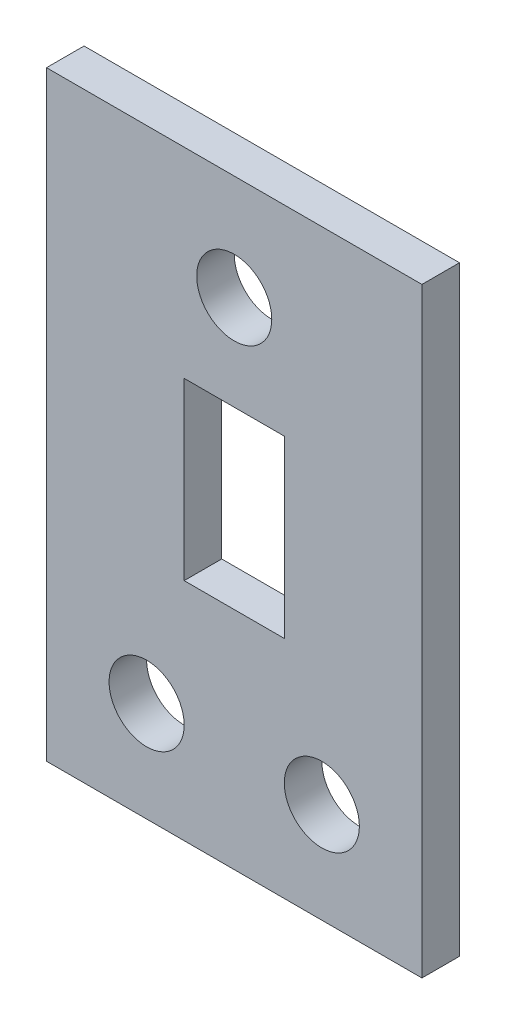
ISO-10303-21;
HEADER;
FILE_DESCRIPTION(('STEP AP214'),'2;1');
FILE_NAME('part.step','',(''),(''),'','','');
FILE_SCHEMA(('AUTOMOTIVE_DESIGN { 1 0 10303 214 1 1 1 1 }'));
ENDSEC;
DATA;
#1=APPLICATION_CONTEXT('core data for automotive mechanical design processes');
#2=APPLICATION_PROTOCOL_DEFINITION('international standard','automotive_design',2000,#1);
#3=PRODUCT_CONTEXT('',#1,'mechanical');
#4=PRODUCT('Part','Part','',(#3));
#5=PRODUCT_RELATED_PRODUCT_CATEGORY('part','',(#4));
#6=PRODUCT_DEFINITION_FORMATION('','',#4);
#7=PRODUCT_DEFINITION_CONTEXT('part definition',#1,'design');
#8=PRODUCT_DEFINITION('design','',#6,#7);
#9=PRODUCT_DEFINITION_SHAPE('','',#8);
#10=(LENGTH_UNIT() NAMED_UNIT(*) SI_UNIT(.MILLI.,.METRE.));
#11=(NAMED_UNIT(*) PLANE_ANGLE_UNIT() SI_UNIT($,.RADIAN.));
#12=(NAMED_UNIT(*) SI_UNIT($,.STERADIAN.) SOLID_ANGLE_UNIT());
#13=UNCERTAINTY_MEASURE_WITH_UNIT(LENGTH_MEASURE(1.E-05),#10,'distance_accuracy_value','');
#14=(GEOMETRIC_REPRESENTATION_CONTEXT(3) GLOBAL_UNCERTAINTY_ASSIGNED_CONTEXT((#13)) GLOBAL_UNIT_ASSIGNED_CONTEXT((#10,
#11,#12)) REPRESENTATION_CONTEXT('',''));
#15=CARTESIAN_POINT('',(0.,0.,0.));
#16=DIRECTION('',(0.,0.,1.));
#17=DIRECTION('',(1.,0.,0.));
#18=AXIS2_PLACEMENT_3D('',#15,#16,#17);
#19=CARTESIAN_POINT('',(-12.5455284850989,32.9531578947368,1.5));
#20=DIRECTION('',(1.,0.,0.));
#21=DIRECTION('',(0.,1.,0.));
#22=AXIS2_PLACEMENT_3D('',#19,#20,#21);
#23=PLANE('',#22);
#24=DIRECTION('',(0.,-1.,0.));
#25=VECTOR('',#24,1.);
#26=CARTESIAN_POINT('',(-12.5455284850989,32.9531578947368,0.));
#27=LINE('',#26,#25);
#28=CARTESIAN_POINT('',(-12.5455284850989,32.9531578947368,0.));
#29=VERTEX_POINT('',#28);
#30=CARTESIAN_POINT('',(-12.5455284850989,8.95315789473685,0.));
#31=VERTEX_POINT('',#30);
#32=EDGE_CURVE('E145',#29,#31,#27,.T.);
#33=ORIENTED_EDGE('',*,*,#32,.T.);
#34=DIRECTION('',(0.,0.,-1.));
#35=VECTOR('',#34,1.);
#36=CARTESIAN_POINT('',(-12.5455284850989,8.95315789473685,1.5));
#37=LINE('',#36,#35);
#38=CARTESIAN_POINT('',(-12.5455284850989,8.95315789473685,1.5));
#39=VERTEX_POINT('',#38);
#40=EDGE_CURVE('E161',#39,#31,#37,.T.);
#41=ORIENTED_EDGE('',*,*,#40,.F.);
#42=DIRECTION('',(0.,-1.,0.));
#43=VECTOR('',#42,1.);
#44=CARTESIAN_POINT('',(-12.5455284850989,32.9531578947368,1.5));
#45=LINE('',#44,#43);
#46=CARTESIAN_POINT('',(-12.5455284850989,32.9531578947368,1.5));
#47=VERTEX_POINT('',#46);
#48=EDGE_CURVE('E134',#47,#39,#45,.T.);
#49=ORIENTED_EDGE('',*,*,#48,.F.);
#50=DIRECTION('',(0.,0.,-1.));
#51=VECTOR('',#50,1.);
#52=CARTESIAN_POINT('',(-12.5455284850989,32.9531578947368,1.5));
#53=LINE('',#52,#51);
#54=EDGE_CURVE('E144',#47,#29,#53,.T.);
#55=ORIENTED_EDGE('',*,*,#54,.T.);
#56=EDGE_LOOP('',(#33,#41,#49,#55));
#57=FACE_BOUND('',#56,.T.);
#58=ADVANCED_FACE('F30',(#57),#23,.F.);
#59=CARTESIAN_POINT('',(-12.5455284850989,8.95315789473685,1.5));
#60=DIRECTION('',(0.,1.,0.));
#61=DIRECTION('',(0.,0.,1.));
#62=AXIS2_PLACEMENT_3D('',#59,#60,#61);
#63=PLANE('',#62);
#64=DIRECTION('',(1.,0.,0.));
#65=VECTOR('',#64,1.);
#66=CARTESIAN_POINT('',(-12.5455284850989,8.95315789473685,0.));
#67=LINE('',#66,#65);
#68=CARTESIAN_POINT('',(2.4544715149011,8.95315789473685,0.));
#69=VERTEX_POINT('',#68);
#70=EDGE_CURVE('E148',#31,#69,#67,.T.);
#71=ORIENTED_EDGE('',*,*,#70,.T.);
#72=DIRECTION('',(0.,0.,-1.));
#73=VECTOR('',#72,1.);
#74=CARTESIAN_POINT('',(2.4544715149011,8.95315789473685,1.5));
#75=LINE('',#74,#73);
#76=CARTESIAN_POINT('',(2.4544715149011,8.95315789473685,1.5));
#77=VERTEX_POINT('',#76);
#78=EDGE_CURVE('E158',#77,#69,#75,.T.);
#79=ORIENTED_EDGE('',*,*,#78,.F.);
#80=DIRECTION('',(1.,0.,0.));
#81=VECTOR('',#80,1.);
#82=CARTESIAN_POINT('',(-12.5455284850989,8.95315789473685,1.5));
#83=LINE('',#82,#81);
#84=EDGE_CURVE('E137',#39,#77,#83,.T.);
#85=ORIENTED_EDGE('',*,*,#84,.F.);
#86=ORIENTED_EDGE('',*,*,#40,.T.);
#87=EDGE_LOOP('',(#71,#79,#85,#86));
#88=FACE_BOUND('',#87,.T.);
#89=ADVANCED_FACE('F193',(#88),#63,.F.);
#90=CARTESIAN_POINT('',(2.45447151490109,32.9531578947368,1.5));
#91=DIRECTION('',(-1.,0.,0.));
#92=DIRECTION('',(0.,-1.,0.));
#93=AXIS2_PLACEMENT_3D('',#90,#91,#92);
#94=PLANE('',#93);
#95=DIRECTION('',(0.,1.,0.));
#96=VECTOR('',#95,1.);
#97=CARTESIAN_POINT('',(2.45447151490109,32.9531578947368,0.));
#98=LINE('',#97,#96);
#99=CARTESIAN_POINT('',(2.45447151490109,32.9531578947368,0.));
#100=VERTEX_POINT('',#99);
#101=EDGE_CURVE('E150',#69,#100,#98,.T.);
#102=ORIENTED_EDGE('',*,*,#101,.T.);
#103=DIRECTION('',(0.,0.,-1.));
#104=VECTOR('',#103,1.);
#105=CARTESIAN_POINT('',(2.45447151490109,32.9531578947368,1.5));
#106=LINE('',#105,#104);
#107=CARTESIAN_POINT('',(2.45447151490109,32.9531578947368,1.5));
#108=VERTEX_POINT('',#107);
#109=EDGE_CURVE('E155',#108,#100,#106,.T.);
#110=ORIENTED_EDGE('',*,*,#109,.F.);
#111=DIRECTION('',(0.,1.,0.));
#112=VECTOR('',#111,1.);
#113=CARTESIAN_POINT('',(2.45447151490109,32.9531578947368,1.5));
#114=LINE('',#113,#112);
#115=EDGE_CURVE('E140',#77,#108,#114,.T.);
#116=ORIENTED_EDGE('',*,*,#115,.F.);
#117=ORIENTED_EDGE('',*,*,#78,.T.);
#118=EDGE_LOOP('',(#102,#110,#116,#117));
#119=FACE_BOUND('',#118,.T.);
#120=ADVANCED_FACE('F198',(#119),#94,.F.);
#121=CARTESIAN_POINT('',(-12.5455284850989,32.9531578947368,1.5));
#122=DIRECTION('',(0.,-1.,0.));
#123=DIRECTION('',(0.,0.,-1.));
#124=AXIS2_PLACEMENT_3D('',#121,#122,#123);
#125=PLANE('',#124);
#126=DIRECTION('',(-1.,0.,0.));
#127=VECTOR('',#126,1.);
#128=CARTESIAN_POINT('',(-12.5455284850989,32.9531578947368,0.));
#129=LINE('',#128,#127);
#130=EDGE_CURVE('E138',#100,#29,#129,.T.);
#131=ORIENTED_EDGE('',*,*,#130,.T.);
#132=ORIENTED_EDGE('',*,*,#54,.F.);
#133=DIRECTION('',(-1.,0.,0.));
#134=VECTOR('',#133,1.);
#135=CARTESIAN_POINT('',(-12.5455284850989,32.9531578947368,1.5));
#136=LINE('',#135,#134);
#137=EDGE_CURVE('E142',#108,#47,#136,.T.);
#138=ORIENTED_EDGE('',*,*,#137,.F.);
#139=ORIENTED_EDGE('',*,*,#109,.T.);
#140=EDGE_LOOP('',(#131,#132,#138,#139));
#141=FACE_BOUND('',#140,.T.);
#142=ADVANCED_FACE('F213',(#141),#125,.F.);
#143=CARTESIAN_POINT('',(-12.5455284850989,8.95315789473685,1.5));
#144=DIRECTION('',(0.,0.,1.));
#145=DIRECTION('',(1.,0.,0.));
#146=AXIS2_PLACEMENT_3D('',#143,#144,#145);
#147=PLANE('',#146);
#148=DIRECTION('',(0.,-1.,0.));
#149=VECTOR('',#148,1.);
#150=CARTESIAN_POINT('',(-7.0455284850989,24.9531578947369,1.5));
#151=LINE('',#150,#149);
#152=CARTESIAN_POINT('',(-7.0455284850989,24.9531578947369,1.5));
#153=VERTEX_POINT('',#152);
#154=CARTESIAN_POINT('',(-7.0455284850989,17.9531578947369,1.5));
#155=VERTEX_POINT('',#154);
#156=EDGE_CURVE('E44',#153,#155,#151,.T.);
#157=ORIENTED_EDGE('',*,*,#156,.F.);
#158=DIRECTION('',(-1.,0.,0.));
#159=VECTOR('',#158,1.);
#160=CARTESIAN_POINT('',(-7.0455284850989,24.9531578947369,1.5));
#161=LINE('',#160,#159);
#162=CARTESIAN_POINT('',(-3.0455284850989,24.9531578947369,1.5));
#163=VERTEX_POINT('',#162);
#164=EDGE_CURVE('E113',#163,#153,#161,.T.);
#165=ORIENTED_EDGE('',*,*,#164,.F.);
#166=DIRECTION('',(0.,1.,0.));
#167=VECTOR('',#166,1.);
#168=CARTESIAN_POINT('',(-3.0455284850989,24.9531578947369,1.5));
#169=LINE('',#168,#167);
#170=CARTESIAN_POINT('',(-3.0455284850989,17.9531578947369,1.5));
#171=VERTEX_POINT('',#170);
#172=EDGE_CURVE('E97',#171,#163,#169,.T.);
#173=ORIENTED_EDGE('',*,*,#172,.F.);
#174=DIRECTION('',(1.,0.,0.));
#175=VECTOR('',#174,1.);
#176=CARTESIAN_POINT('',(-7.0455284850989,17.9531578947369,1.5));
#177=LINE('',#176,#175);
#178=EDGE_CURVE('E106',#155,#171,#177,.T.);
#179=ORIENTED_EDGE('',*,*,#178,.F.);
#180=EDGE_LOOP('',(#157,#165,#173,#179));
#181=FACE_BOUND('',#180,.T.);
#182=CARTESIAN_POINT('',(-5.04552848509891,28.7473865287968,1.5));
#183=DIRECTION('',(0.,0.,1.));
#184=DIRECTION('',(1.,0.,0.));
#185=AXIS2_PLACEMENT_3D('',#182,#183,#184);
#186=CIRCLE('',#185,1.5);
#187=CARTESIAN_POINT('',(-3.5455284850989,28.7473865287968,1.5));
#188=VERTEX_POINT('',#187);
#189=EDGE_CURVE('E120',#188,#188,#186,.T.);
#190=ORIENTED_EDGE('',*,*,#189,.F.);
#191=EDGE_LOOP('',(#190));
#192=FACE_BOUND('',#191,.T.);
#193=CARTESIAN_POINT('',(-1.5455284850989,12.9531578947369,1.5));
#194=DIRECTION('',(0.,0.,1.));
#195=DIRECTION('',(1.,0.,0.));
#196=AXIS2_PLACEMENT_3D('',#193,#194,#195);
#197=CIRCLE('',#196,1.5);
#198=CARTESIAN_POINT('',(-0.0455284850989005,12.9531578947369,1.5));
#199=VERTEX_POINT('',#198);
#200=EDGE_CURVE('E126',#199,#199,#197,.T.);
#201=ORIENTED_EDGE('',*,*,#200,.F.);
#202=EDGE_LOOP('',(#201));
#203=FACE_BOUND('',#202,.T.);
#204=CARTESIAN_POINT('',(-8.54552848509891,12.9531578947369,1.5));
#205=DIRECTION('',(0.,0.,1.));
#206=DIRECTION('',(1.,0.,0.));
#207=AXIS2_PLACEMENT_3D('',#204,#205,#206);
#208=CIRCLE('',#207,1.5);
#209=CARTESIAN_POINT('',(-7.0455284850989,12.9531578947369,1.5));
#210=VERTEX_POINT('',#209);
#211=EDGE_CURVE('E130',#210,#210,#208,.T.);
#212=ORIENTED_EDGE('',*,*,#211,.F.);
#213=EDGE_LOOP('',(#212));
#214=FACE_BOUND('',#213,.T.);
#215=ORIENTED_EDGE('',*,*,#48,.T.);
#216=ORIENTED_EDGE('',*,*,#84,.T.);
#217=ORIENTED_EDGE('',*,*,#115,.T.);
#218=ORIENTED_EDGE('',*,*,#137,.T.);
#219=EDGE_LOOP('',(#215,#216,#217,#218));
#220=FACE_BOUND('',#219,.T.);
#221=ADVANCED_FACE('F110',(#181,#192,#203,#214,#220),#147,.T.);
#222=CARTESIAN_POINT('',(-12.5455284850989,8.95315789473685,0.));
#223=DIRECTION('',(0.,0.,1.));
#224=DIRECTION('',(1.,0.,0.));
#225=AXIS2_PLACEMENT_3D('',#222,#223,#224);
#226=PLANE('',#225);
#227=DIRECTION('',(-1.,0.,0.));
#228=VECTOR('',#227,1.);
#229=CARTESIAN_POINT('',(-12.5455284850989,24.9531578947369,0.));
#230=LINE('',#229,#228);
#231=CARTESIAN_POINT('',(-3.0455284850989,24.9531578947369,0.));
#232=VERTEX_POINT('',#231);
#233=CARTESIAN_POINT('',(-7.0455284850989,24.9531578947369,0.));
#234=VERTEX_POINT('',#233);
#235=EDGE_CURVE('E37',#232,#234,#230,.T.);
#236=ORIENTED_EDGE('',*,*,#235,.T.);
#237=DIRECTION('',(0.,-1.,0.));
#238=VECTOR('',#237,1.);
#239=CARTESIAN_POINT('',(-7.0455284850989,8.95315789473685,0.));
#240=LINE('',#239,#238);
#241=CARTESIAN_POINT('',(-7.0455284850989,17.9531578947369,0.));
#242=VERTEX_POINT('',#241);
#243=EDGE_CURVE('E11',#234,#242,#240,.T.);
#244=ORIENTED_EDGE('',*,*,#243,.T.);
#245=DIRECTION('',(1.,0.,0.));
#246=VECTOR('',#245,1.);
#247=CARTESIAN_POINT('',(-12.5455284850989,17.9531578947369,0.));
#248=LINE('',#247,#246);
#249=CARTESIAN_POINT('',(-3.0455284850989,17.9531578947369,0.));
#250=VERTEX_POINT('',#249);
#251=EDGE_CURVE('E164',#242,#250,#248,.T.);
#252=ORIENTED_EDGE('',*,*,#251,.T.);
#253=DIRECTION('',(0.,1.,0.));
#254=VECTOR('',#253,1.);
#255=CARTESIAN_POINT('',(-3.0455284850989,8.95315789473685,0.));
#256=LINE('',#255,#254);
#257=EDGE_CURVE('E100',#250,#232,#256,.T.);
#258=ORIENTED_EDGE('',*,*,#257,.T.);
#259=EDGE_LOOP('',(#236,#244,#252,#258));
#260=FACE_BOUND('',#259,.T.);
#261=CARTESIAN_POINT('',(-5.04552848509891,28.7473865287968,0.));
#262=DIRECTION('',(0.,0.,1.));
#263=DIRECTION('',(1.,0.,0.));
#264=AXIS2_PLACEMENT_3D('',#261,#262,#263);
#265=CIRCLE('',#264,1.5);
#266=CARTESIAN_POINT('',(-3.5455284850989,28.7473865287968,0.));
#267=VERTEX_POINT('',#266);
#268=EDGE_CURVE('E125',#267,#267,#265,.T.);
#269=ORIENTED_EDGE('',*,*,#268,.T.);
#270=EDGE_LOOP('',(#269));
#271=FACE_BOUND('',#270,.T.);
#272=CARTESIAN_POINT('',(-1.5455284850989,12.9531578947369,0.));
#273=DIRECTION('',(0.,0.,1.));
#274=DIRECTION('',(1.,0.,0.));
#275=AXIS2_PLACEMENT_3D('',#272,#273,#274);
#276=CIRCLE('',#275,1.5);
#277=CARTESIAN_POINT('',(-0.0455284850989005,12.9531578947369,0.));
#278=VERTEX_POINT('',#277);
#279=EDGE_CURVE('E129',#278,#278,#276,.T.);
#280=ORIENTED_EDGE('',*,*,#279,.T.);
#281=EDGE_LOOP('',(#280));
#282=FACE_BOUND('',#281,.T.);
#283=CARTESIAN_POINT('',(-8.54552848509891,12.9531578947369,0.));
#284=DIRECTION('',(0.,0.,1.));
#285=DIRECTION('',(1.,0.,0.));
#286=AXIS2_PLACEMENT_3D('',#283,#284,#285);
#287=CIRCLE('',#286,1.5);
#288=CARTESIAN_POINT('',(-7.0455284850989,12.9531578947369,0.));
#289=VERTEX_POINT('',#288);
#290=EDGE_CURVE('E133',#289,#289,#287,.T.);
#291=ORIENTED_EDGE('',*,*,#290,.T.);
#292=EDGE_LOOP('',(#291));
#293=FACE_BOUND('',#292,.T.);
#294=ORIENTED_EDGE('',*,*,#32,.F.);
#295=ORIENTED_EDGE('',*,*,#130,.F.);
#296=ORIENTED_EDGE('',*,*,#101,.F.);
#297=ORIENTED_EDGE('',*,*,#70,.F.);
#298=EDGE_LOOP('',(#294,#295,#296,#297));
#299=FACE_BOUND('',#298,.T.);
#300=ADVANCED_FACE('F174',(#260,#271,#282,#293,#299),#226,.F.);
#301=CARTESIAN_POINT('',(-8.54552848509891,12.9531578947369,-0.5));
#302=DIRECTION('',(0.,0.,1.));
#303=DIRECTION('',(1.,0.,0.));
#304=AXIS2_PLACEMENT_3D('',#301,#302,#303);
#305=CYLINDRICAL_SURFACE('',#304,1.5);
#306=ORIENTED_EDGE('',*,*,#211,.T.);
#307=EDGE_LOOP('',(#306));
#308=FACE_BOUND('',#307,.T.);
#309=ORIENTED_EDGE('',*,*,#290,.F.);
#310=EDGE_LOOP('',(#309));
#311=FACE_BOUND('',#310,.T.);
#312=ADVANCED_FACE('F224',(#308,#311),#305,.F.);
#313=CARTESIAN_POINT('',(-1.5455284850989,12.9531578947369,-0.5));
#314=DIRECTION('',(0.,0.,1.));
#315=DIRECTION('',(1.,0.,0.));
#316=AXIS2_PLACEMENT_3D('',#313,#314,#315);
#317=CYLINDRICAL_SURFACE('',#316,1.5);
#318=ORIENTED_EDGE('',*,*,#200,.T.);
#319=EDGE_LOOP('',(#318));
#320=FACE_BOUND('',#319,.T.);
#321=ORIENTED_EDGE('',*,*,#279,.F.);
#322=EDGE_LOOP('',(#321));
#323=FACE_BOUND('',#322,.T.);
#324=ADVANCED_FACE('F188',(#320,#323),#317,.F.);
#325=CARTESIAN_POINT('',(-5.04552848509891,28.7473865287968,-0.5));
#326=DIRECTION('',(0.,0.,1.));
#327=DIRECTION('',(1.,0.,0.));
#328=AXIS2_PLACEMENT_3D('',#325,#326,#327);
#329=CYLINDRICAL_SURFACE('',#328,1.5);
#330=ORIENTED_EDGE('',*,*,#189,.T.);
#331=EDGE_LOOP('',(#330));
#332=FACE_BOUND('',#331,.T.);
#333=ORIENTED_EDGE('',*,*,#268,.F.);
#334=EDGE_LOOP('',(#333));
#335=FACE_BOUND('',#334,.T.);
#336=ADVANCED_FACE('F181',(#332,#335),#329,.F.);
#337=CARTESIAN_POINT('',(-7.0455284850989,24.9531578947369,-0.5));
#338=DIRECTION('',(-1.,0.,0.));
#339=DIRECTION('',(0.,0.,1.));
#340=AXIS2_PLACEMENT_3D('',#337,#338,#339);
#341=PLANE('',#340);
#342=DIRECTION('',(0.,0.,1.));
#343=VECTOR('',#342,1.);
#344=CARTESIAN_POINT('',(-7.0455284850989,24.9531578947369,-0.5));
#345=LINE('',#344,#343);
#346=EDGE_CURVE('E118',#234,#153,#345,.T.);
#347=ORIENTED_EDGE('',*,*,#346,.T.);
#348=ORIENTED_EDGE('',*,*,#156,.T.);
#349=DIRECTION('',(0.,0.,1.));
#350=VECTOR('',#349,1.);
#351=CARTESIAN_POINT('',(-7.0455284850989,17.9531578947369,-0.5));
#352=LINE('',#351,#350);
#353=EDGE_CURVE('E103',#242,#155,#352,.T.);
#354=ORIENTED_EDGE('',*,*,#353,.F.);
#355=ORIENTED_EDGE('',*,*,#243,.F.);
#356=EDGE_LOOP('',(#347,#348,#354,#355));
#357=FACE_BOUND('',#356,.T.);
#358=ADVANCED_FACE('F179',(#357),#341,.F.);
#359=CARTESIAN_POINT('',(-7.0455284850989,24.9531578947369,-0.5));
#360=DIRECTION('',(0.,1.,0.));
#361=DIRECTION('',(0.,0.,1.));
#362=AXIS2_PLACEMENT_3D('',#359,#360,#361);
#363=PLANE('',#362);
#364=DIRECTION('',(0.,0.,1.));
#365=VECTOR('',#364,1.);
#366=CARTESIAN_POINT('',(-3.0455284850989,24.9531578947369,-0.5));
#367=LINE('',#366,#365);
#368=EDGE_CURVE('E102',#232,#163,#367,.T.);
#369=ORIENTED_EDGE('',*,*,#368,.T.);
#370=ORIENTED_EDGE('',*,*,#164,.T.);
#371=ORIENTED_EDGE('',*,*,#346,.F.);
#372=ORIENTED_EDGE('',*,*,#235,.F.);
#373=EDGE_LOOP('',(#369,#370,#371,#372));
#374=FACE_BOUND('',#373,.T.);
#375=ADVANCED_FACE('F178',(#374),#363,.F.);
#376=CARTESIAN_POINT('',(-3.0455284850989,24.9531578947369,-0.5));
#377=DIRECTION('',(1.,0.,0.));
#378=DIRECTION('',(0.,1.,0.));
#379=AXIS2_PLACEMENT_3D('',#376,#377,#378);
#380=PLANE('',#379);
#381=DIRECTION('',(0.,0.,1.));
#382=VECTOR('',#381,1.);
#383=CARTESIAN_POINT('',(-3.0455284850989,17.9531578947369,-0.5));
#384=LINE('',#383,#382);
#385=EDGE_CURVE('E52',#250,#171,#384,.T.);
#386=ORIENTED_EDGE('',*,*,#385,.T.);
#387=ORIENTED_EDGE('',*,*,#172,.T.);
#388=ORIENTED_EDGE('',*,*,#368,.F.);
#389=ORIENTED_EDGE('',*,*,#257,.F.);
#390=EDGE_LOOP('',(#386,#387,#388,#389));
#391=FACE_BOUND('',#390,.T.);
#392=ADVANCED_FACE('F94',(#391),#380,.F.);
#393=CARTESIAN_POINT('',(-7.0455284850989,17.9531578947369,-0.5));
#394=DIRECTION('',(0.,-1.,0.));
#395=DIRECTION('',(0.,0.,-1.));
#396=AXIS2_PLACEMENT_3D('',#393,#394,#395);
#397=PLANE('',#396);
#398=ORIENTED_EDGE('',*,*,#353,.T.);
#399=ORIENTED_EDGE('',*,*,#178,.T.);
#400=ORIENTED_EDGE('',*,*,#385,.F.);
#401=ORIENTED_EDGE('',*,*,#251,.F.);
#402=EDGE_LOOP('',(#398,#399,#400,#401));
#403=FACE_BOUND('',#402,.T.);
#404=ADVANCED_FACE('F107',(#403),#397,.F.);
#405=CLOSED_SHELL('',(#58,#89,#120,#142,#221,#300,#312,#324,#336,#358,#375,#392,#404));
#406=MANIFOLD_SOLID_BREP('B2',#405);
#407=ADVANCED_BREP_SHAPE_REPRESENTATION('',(#18,#406),#14);
#408=SHAPE_DEFINITION_REPRESENTATION(#9,#407);
ENDSEC;
END-ISO-10303-21;
